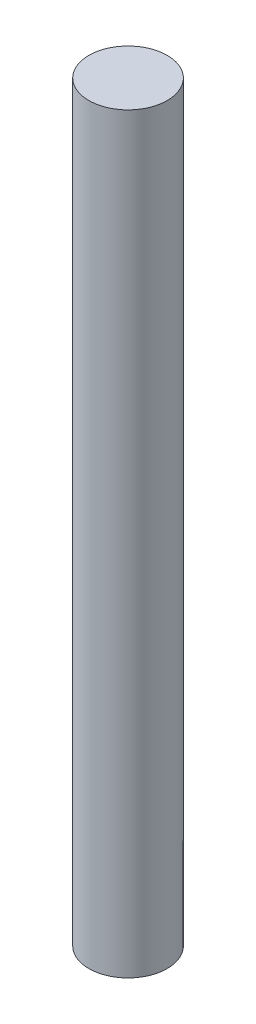
ISO-10303-21;
HEADER;
FILE_DESCRIPTION(('STEP AP214'),'2;1');
FILE_NAME('part.step','',(''),(''),'','','');
FILE_SCHEMA(('AUTOMOTIVE_DESIGN { 1 0 10303 214 1 1 1 1 }'));
ENDSEC;
DATA;
#1=APPLICATION_CONTEXT('core data for automotive mechanical design processes');
#2=APPLICATION_PROTOCOL_DEFINITION('international standard','automotive_design',2000,#1);
#3=PRODUCT_CONTEXT('',#1,'mechanical');
#4=PRODUCT('Part','Part','',(#3));
#5=PRODUCT_RELATED_PRODUCT_CATEGORY('part','',(#4));
#6=PRODUCT_DEFINITION_FORMATION('','',#4);
#7=PRODUCT_DEFINITION_CONTEXT('part definition',#1,'design');
#8=PRODUCT_DEFINITION('design','',#6,#7);
#9=PRODUCT_DEFINITION_SHAPE('','',#8);
#10=(LENGTH_UNIT() NAMED_UNIT(*) SI_UNIT(.MILLI.,.METRE.));
#11=(NAMED_UNIT(*) PLANE_ANGLE_UNIT() SI_UNIT($,.RADIAN.));
#12=(NAMED_UNIT(*) SI_UNIT($,.STERADIAN.) SOLID_ANGLE_UNIT());
#13=UNCERTAINTY_MEASURE_WITH_UNIT(LENGTH_MEASURE(1.E-05),#10,'distance_accuracy_value','');
#14=(GEOMETRIC_REPRESENTATION_CONTEXT(3) GLOBAL_UNCERTAINTY_ASSIGNED_CONTEXT((#13)) GLOBAL_UNIT_ASSIGNED_CONTEXT((#10,
#11,#12)) REPRESENTATION_CONTEXT('',''));
#15=CARTESIAN_POINT('',(0.,0.,0.));
#16=DIRECTION('',(0.,0.,1.));
#17=DIRECTION('',(1.,0.,0.));
#18=AXIS2_PLACEMENT_3D('',#15,#16,#17);
#19=CARTESIAN_POINT('',(0.,304.8,0.));
#20=DIRECTION('',(0.,-1.,0.));
#21=DIRECTION('',(0.,0.,-1.));
#22=AXIS2_PLACEMENT_3D('',#19,#20,#21);
#23=CYLINDRICAL_SURFACE('',#22,15.875);
#24=CARTESIAN_POINT('',(0.,304.8,0.));
#25=DIRECTION('',(0.,1.,0.));
#26=DIRECTION('',(0.,0.,1.));
#27=AXIS2_PLACEMENT_3D('',#24,#25,#26);
#28=CIRCLE('',#27,15.875);
#29=CARTESIAN_POINT('',(0.,304.8,-15.875));
#30=VERTEX_POINT('',#29);
#31=EDGE_CURVE('E10',#30,#30,#28,.T.);
#32=CARTESIAN_POINT('',(0.,0.,0.));
#33=DIRECTION('',(0.,1.,0.));
#34=DIRECTION('',(0.,0.,1.));
#35=AXIS2_PLACEMENT_3D('',#32,#33,#34);
#36=CIRCLE('',#35,15.875);
#37=CARTESIAN_POINT('',(0.,0.,-15.875));
#38=VERTEX_POINT('',#37);
#39=EDGE_CURVE('E33',#38,#38,#36,.T.);
#40=CARTESIAN_POINT('',(0.,304.8,-15.875));
#41=CARTESIAN_POINT('',(0.,301.625,-15.875));
#42=CARTESIAN_POINT('',(0.,298.45,-15.875));
#43=CARTESIAN_POINT('',(0.,292.1,-15.875));
#44=CARTESIAN_POINT('',(0.,288.925,-15.875));
#45=CARTESIAN_POINT('',(0.,282.575,-15.875));
#46=CARTESIAN_POINT('',(0.,279.4,-15.875));
#47=CARTESIAN_POINT('',(0.,273.05,-15.875));
#48=CARTESIAN_POINT('',(0.,269.875,-15.875));
#49=CARTESIAN_POINT('',(0.,263.525,-15.875));
#50=CARTESIAN_POINT('',(0.,260.35,-15.875));
#51=CARTESIAN_POINT('',(0.,254.,-15.875));
#52=CARTESIAN_POINT('',(0.,250.825,-15.875));
#53=CARTESIAN_POINT('',(0.,244.475,-15.875));
#54=CARTESIAN_POINT('',(0.,241.3,-15.875));
#55=CARTESIAN_POINT('',(0.,234.95,-15.875));
#56=CARTESIAN_POINT('',(0.,231.775,-15.875));
#57=CARTESIAN_POINT('',(0.,225.425,-15.875));
#58=CARTESIAN_POINT('',(0.,222.25,-15.875));
#59=CARTESIAN_POINT('',(0.,215.9,-15.875));
#60=CARTESIAN_POINT('',(0.,212.725,-15.875));
#61=CARTESIAN_POINT('',(0.,206.375,-15.875));
#62=CARTESIAN_POINT('',(0.,203.2,-15.875));
#63=CARTESIAN_POINT('',(0.,196.85,-15.875));
#64=CARTESIAN_POINT('',(0.,193.675,-15.875));
#65=CARTESIAN_POINT('',(0.,187.325,-15.875));
#66=CARTESIAN_POINT('',(0.,184.15,-15.875));
#67=CARTESIAN_POINT('',(0.,177.8,-15.875));
#68=CARTESIAN_POINT('',(0.,174.625,-15.875));
#69=CARTESIAN_POINT('',(0.,168.275,-15.875));
#70=CARTESIAN_POINT('',(0.,165.1,-15.875));
#71=CARTESIAN_POINT('',(0.,158.75,-15.875));
#72=CARTESIAN_POINT('',(0.,155.575,-15.875));
#73=CARTESIAN_POINT('',(0.,149.225,-15.875));
#74=CARTESIAN_POINT('',(0.,146.05,-15.875));
#75=CARTESIAN_POINT('',(0.,139.7,-15.875));
#76=CARTESIAN_POINT('',(0.,136.525,-15.875));
#77=CARTESIAN_POINT('',(0.,130.175,-15.875));
#78=CARTESIAN_POINT('',(0.,127.,-15.875));
#79=CARTESIAN_POINT('',(0.,120.65,-15.875));
#80=CARTESIAN_POINT('',(0.,117.475,-15.875));
#81=CARTESIAN_POINT('',(0.,111.125,-15.875));
#82=CARTESIAN_POINT('',(0.,107.95,-15.875));
#83=CARTESIAN_POINT('',(0.,101.6,-15.875));
#84=CARTESIAN_POINT('',(0.,98.425,-15.875));
#85=CARTESIAN_POINT('',(0.,92.075,-15.875));
#86=CARTESIAN_POINT('',(0.,88.9,-15.875));
#87=CARTESIAN_POINT('',(0.,82.55,-15.875));
#88=CARTESIAN_POINT('',(0.,79.375,-15.875));
#89=CARTESIAN_POINT('',(0.,73.025,-15.875));
#90=CARTESIAN_POINT('',(0.,69.85,-15.875));
#91=CARTESIAN_POINT('',(0.,63.5,-15.875));
#92=CARTESIAN_POINT('',(0.,60.325,-15.875));
#93=CARTESIAN_POINT('',(0.,53.975,-15.875));
#94=CARTESIAN_POINT('',(0.,50.8,-15.875));
#95=CARTESIAN_POINT('',(0.,44.45,-15.875));
#96=CARTESIAN_POINT('',(0.,41.275,-15.875));
#97=CARTESIAN_POINT('',(0.,34.925,-15.875));
#98=CARTESIAN_POINT('',(0.,31.75,-15.875));
#99=CARTESIAN_POINT('',(0.,25.4,-15.875));
#100=CARTESIAN_POINT('',(0.,22.225,-15.875));
#101=CARTESIAN_POINT('',(0.,15.875,-15.875));
#102=CARTESIAN_POINT('',(0.,12.7,-15.875));
#103=CARTESIAN_POINT('',(0.,6.35,-15.875));
#104=CARTESIAN_POINT('',(0.,3.175,-15.875));
#105=CARTESIAN_POINT('',(0.,0.,-15.875));
#106=B_SPLINE_CURVE_WITH_KNOTS('',3,(#40,#41,#42,#43,#44,#45,#46,#47,#48,#49,#50,#51,#52,#53,
#54,#55,#56,#57,#58,#59,#60,#61,#62,#63,#64,#65,#66,#67,#68,#69,#70,#71,#72,#73,#74,#75,#76,#77,
#78,#79,#80,#81,#82,#83,#84,#85,#86,#87,#88,#89,#90,#91,#92,#93,#94,#95,#96,#97,#98,#99,#100,
#101,#102,#103,#104,#105),.UNSPECIFIED.,.F.,.F.,(4,2,2,2,2,2,2,2,2,2,2,2,2,2,2,2,2,2,2,2,2,2,2,
2,2,2,2,2,2,2,2,2,4),(0.,9.52500000000001,19.05,28.575,38.1,47.625,57.15,66.675,76.2,
85.7250000000001,95.2500000000001,104.775,114.3,123.825,133.35,142.875,152.4,161.925,171.45,
180.975,190.5,200.025,209.55,219.075,228.6,238.125,247.65,257.175,266.7,276.225,285.75,295.275,
304.8),.UNSPECIFIED.);
#107=EDGE_CURVE('BSEAM30',#30,#38,#106,.T.);
#108=ORIENTED_EDGE('',*,*,#31,.F.);
#109=ORIENTED_EDGE('',*,*,#39,.T.);
#110=ORIENTED_EDGE('',*,*,#107,.T.);
#111=ORIENTED_EDGE('',*,*,#107,.F.);
#112=EDGE_LOOP('',(#108,#110,#109,#111));
#113=FACE_BOUND('',#112,.T.);
#114=ADVANCED_FACE('F30',(#113),#23,.T.);
#115=CARTESIAN_POINT('',(0.,304.8,0.));
#116=DIRECTION('',(0.,1.,0.));
#117=DIRECTION('',(0.,0.,1.));
#118=AXIS2_PLACEMENT_3D('',#115,#116,#117);
#119=PLANE('',#118);
#120=ORIENTED_EDGE('',*,*,#31,.T.);
#121=EDGE_LOOP('',(#120));
#122=FACE_BOUND('',#121,.T.);
#123=ADVANCED_FACE('F45',(#122),#119,.T.);
#124=CARTESIAN_POINT('',(0.,0.,0.));
#125=DIRECTION('',(0.,1.,0.));
#126=DIRECTION('',(0.,0.,1.));
#127=AXIS2_PLACEMENT_3D('',#124,#125,#126);
#128=PLANE('',#127);
#129=ORIENTED_EDGE('',*,*,#39,.F.);
#130=EDGE_LOOP('',(#129));
#131=FACE_BOUND('',#130,.T.);
#132=ADVANCED_FACE('F43',(#131),#128,.F.);
#133=CLOSED_SHELL('',(#114,#123,#132));
#134=MANIFOLD_SOLID_BREP('B2',#133);
#135=ADVANCED_BREP_SHAPE_REPRESENTATION('',(#18,#134),#14);
#136=SHAPE_DEFINITION_REPRESENTATION(#9,#135);
ENDSEC;
END-ISO-10303-21;
